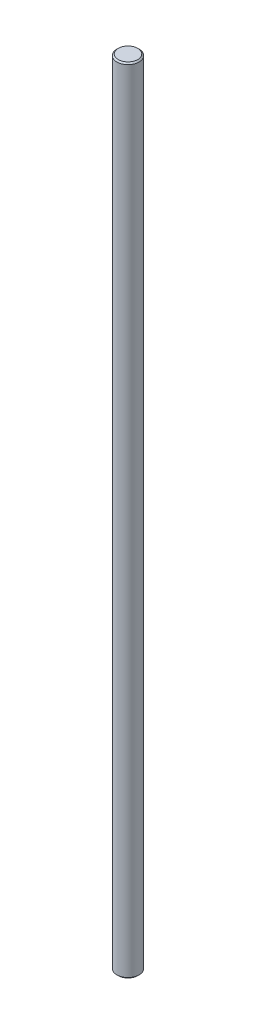
ISO-10303-21;
HEADER;
FILE_DESCRIPTION(('STEP AP214'),'2;1');
FILE_NAME('part.step','',(''),(''),'','','');
FILE_SCHEMA(('AUTOMOTIVE_DESIGN { 1 0 10303 214 1 1 1 1 }'));
ENDSEC;
DATA;
#1=APPLICATION_CONTEXT('core data for automotive mechanical design processes');
#2=APPLICATION_PROTOCOL_DEFINITION('international standard','automotive_design',2000,#1);
#3=PRODUCT_CONTEXT('',#1,'mechanical');
#4=PRODUCT('Part','Part','',(#3));
#5=PRODUCT_RELATED_PRODUCT_CATEGORY('part','',(#4));
#6=PRODUCT_DEFINITION_FORMATION('','',#4);
#7=PRODUCT_DEFINITION_CONTEXT('part definition',#1,'design');
#8=PRODUCT_DEFINITION('design','',#6,#7);
#9=PRODUCT_DEFINITION_SHAPE('','',#8);
#10=(LENGTH_UNIT() NAMED_UNIT(*) SI_UNIT(.MILLI.,.METRE.));
#11=(NAMED_UNIT(*) PLANE_ANGLE_UNIT() SI_UNIT($,.RADIAN.));
#12=(NAMED_UNIT(*) SI_UNIT($,.STERADIAN.) SOLID_ANGLE_UNIT());
#13=UNCERTAINTY_MEASURE_WITH_UNIT(LENGTH_MEASURE(1.E-05),#10,'distance_accuracy_value','');
#14=(GEOMETRIC_REPRESENTATION_CONTEXT(3) GLOBAL_UNCERTAINTY_ASSIGNED_CONTEXT((#13)) GLOBAL_UNIT_ASSIGNED_CONTEXT((#10,
#11,#12)) REPRESENTATION_CONTEXT('',''));
#15=CARTESIAN_POINT('',(0.,0.,0.));
#16=DIRECTION('',(0.,0.,1.));
#17=DIRECTION('',(1.,0.,0.));
#18=AXIS2_PLACEMENT_3D('',#15,#16,#17);
#19=CARTESIAN_POINT('',(0.,-142.5,0.));
#20=DIRECTION('',(0.,1.,0.));
#21=DIRECTION('',(1.,0.,0.));
#22=AXIS2_PLACEMENT_3D('',#19,#20,#21);
#23=PLANE('',#22);
#24=CARTESIAN_POINT('',(0.,-142.5,0.));
#25=DIRECTION('',(0.,-1.,0.));
#26=DIRECTION('',(1.,0.,0.));
#27=AXIS2_PLACEMENT_3D('',#24,#25,#26);
#28=CIRCLE('',#27,3.5);
#29=CARTESIAN_POINT('',(3.5,-142.5,0.));
#30=VERTEX_POINT('',#29);
#31=EDGE_CURVE('E10',#30,#30,#28,.T.);
#32=ORIENTED_EDGE('',*,*,#31,.T.);
#33=EDGE_LOOP('',(#32));
#34=FACE_BOUND('',#33,.T.);
#35=ADVANCED_FACE('F15',(#34),#23,.F.);
#36=CARTESIAN_POINT('',(0.,-142.2500000211,0.));
#37=DIRECTION('',(0.,1.,0.));
#38=DIRECTION('',(0.,0.,-1.));
#39=AXIS2_PLACEMENT_3D('',#36,#37,#38);
#40=CONICAL_SURFACE('',#39,3.749999978949,0.7853981633973);
#41=CARTESIAN_POINT('',(0.,-142.,0.));
#42=DIRECTION('',(0.,-1.,0.));
#43=DIRECTION('',(-1.,0.,0.));
#44=AXIS2_PLACEMENT_3D('',#41,#42,#43);
#45=CIRCLE('',#44,4.);
#46=CARTESIAN_POINT('',(-4.,-142.,0.));
#47=VERTEX_POINT('',#46);
#48=EDGE_CURVE('E23',#47,#47,#45,.T.);
#49=ORIENTED_EDGE('',*,*,#48,.T.);
#50=EDGE_LOOP('',(#49));
#51=FACE_BOUND('',#50,.T.);
#52=ORIENTED_EDGE('',*,*,#31,.F.);
#53=EDGE_LOOP('',(#52));
#54=FACE_BOUND('',#53,.T.);
#55=ADVANCED_FACE('F45',(#51,#54),#40,.T.);
#56=CARTESIAN_POINT('',(0.,-142.5,0.));
#57=DIRECTION('',(0.,1.,0.));
#58=DIRECTION('',(1.,0.,0.));
#59=AXIS2_PLACEMENT_3D('',#56,#57,#58);
#60=CYLINDRICAL_SURFACE('',#59,4.);
#61=CARTESIAN_POINT('',(0.,142.,0.));
#62=DIRECTION('',(0.,1.,0.));
#63=DIRECTION('',(-1.,0.,0.));
#64=AXIS2_PLACEMENT_3D('',#61,#62,#63);
#65=CIRCLE('',#64,4.);
#66=CARTESIAN_POINT('',(-4.,142.,0.));
#67=VERTEX_POINT('',#66);
#68=EDGE_CURVE('E28',#67,#67,#65,.T.);
#69=ORIENTED_EDGE('',*,*,#68,.F.);
#70=EDGE_LOOP('',(#69));
#71=FACE_BOUND('',#70,.T.);
#72=ORIENTED_EDGE('',*,*,#48,.F.);
#73=EDGE_LOOP('',(#72));
#74=FACE_BOUND('',#73,.T.);
#75=ADVANCED_FACE('F39',(#71,#74),#60,.T.);
#76=CARTESIAN_POINT('',(0.,142.2500000211,0.));
#77=DIRECTION('',(0.,-1.,0.));
#78=DIRECTION('',(0.,0.,-1.));
#79=AXIS2_PLACEMENT_3D('',#76,#77,#78);
#80=CONICAL_SURFACE('',#79,3.749999978949,0.7853981633973);
#81=ORIENTED_EDGE('',*,*,#68,.T.);
#82=EDGE_LOOP('',(#81));
#83=FACE_BOUND('',#82,.T.);
#84=CARTESIAN_POINT('',(0.,142.5,0.));
#85=DIRECTION('',(0.,1.,0.));
#86=DIRECTION('',(-1.,0.,0.));
#87=AXIS2_PLACEMENT_3D('',#84,#85,#86);
#88=CIRCLE('',#87,3.5);
#89=CARTESIAN_POINT('',(-3.5,142.5,0.));
#90=VERTEX_POINT('',#89);
#91=EDGE_CURVE('E19',#90,#90,#88,.T.);
#92=ORIENTED_EDGE('',*,*,#91,.F.);
#93=EDGE_LOOP('',(#92));
#94=FACE_BOUND('',#93,.T.);
#95=ADVANCED_FACE('F37',(#83,#94),#80,.T.);
#96=CARTESIAN_POINT('',(0.,142.5,0.));
#97=DIRECTION('',(0.,1.,0.));
#98=DIRECTION('',(1.,0.,0.));
#99=AXIS2_PLACEMENT_3D('',#96,#97,#98);
#100=PLANE('',#99);
#101=ORIENTED_EDGE('',*,*,#91,.T.);
#102=EDGE_LOOP('',(#101));
#103=FACE_BOUND('',#102,.T.);
#104=ADVANCED_FACE('F17',(#103),#100,.T.);
#105=CLOSED_SHELL('',(#35,#55,#75,#95,#104));
#106=MANIFOLD_SOLID_BREP('B1',#105);
#107=ADVANCED_BREP_SHAPE_REPRESENTATION('',(#18,#106),#14);
#108=SHAPE_DEFINITION_REPRESENTATION(#9,#107);
ENDSEC;
END-ISO-10303-21;
